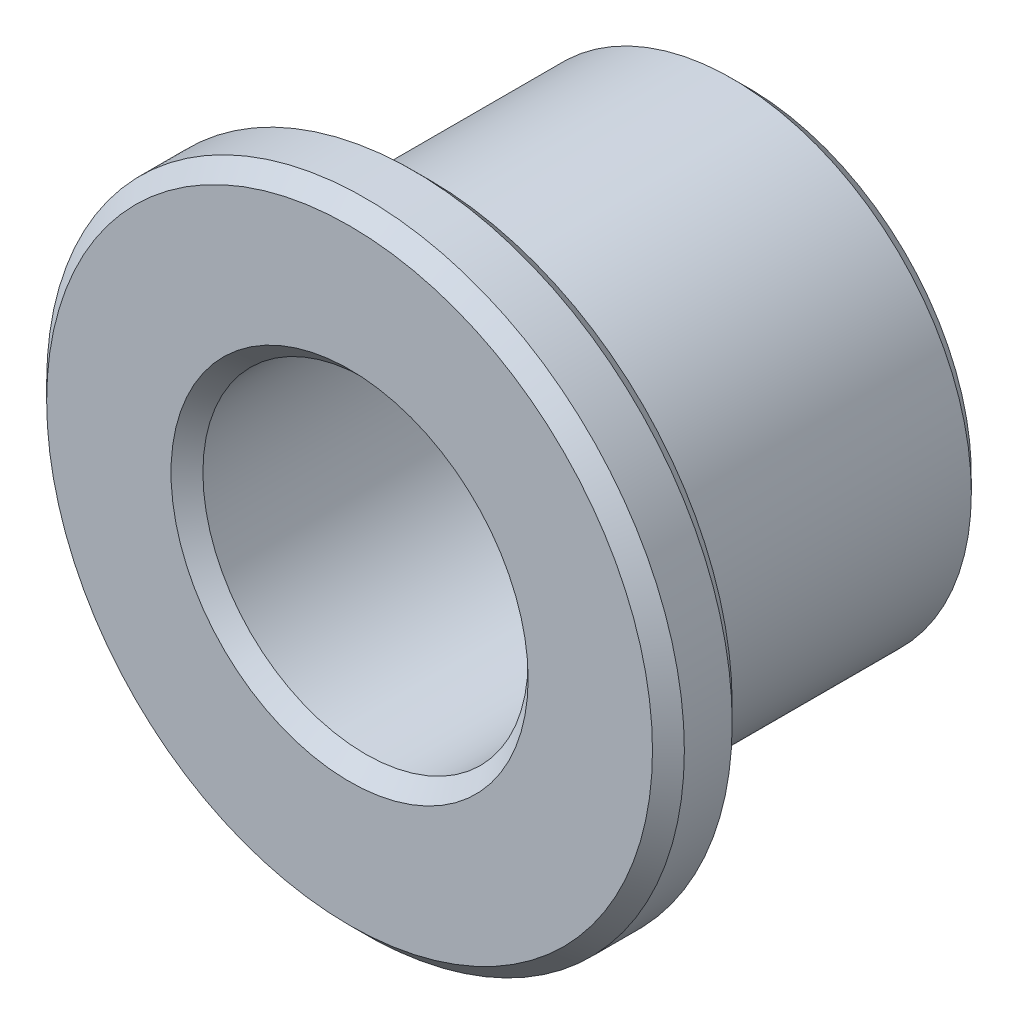
ISO-10303-21;
HEADER;
FILE_DESCRIPTION(('STEP AP214'),'2;1');
FILE_NAME('part.step','',(''),(''),'','','');
FILE_SCHEMA(('AUTOMOTIVE_DESIGN { 1 0 10303 214 1 1 1 1 }'));
ENDSEC;
DATA;
#1=APPLICATION_CONTEXT('core data for automotive mechanical design processes');
#2=APPLICATION_PROTOCOL_DEFINITION('international standard','automotive_design',2000,#1);
#3=PRODUCT_CONTEXT('',#1,'mechanical');
#4=PRODUCT('Part','Part','',(#3));
#5=PRODUCT_RELATED_PRODUCT_CATEGORY('part','',(#4));
#6=PRODUCT_DEFINITION_FORMATION('','',#4);
#7=PRODUCT_DEFINITION_CONTEXT('part definition',#1,'design');
#8=PRODUCT_DEFINITION('design','',#6,#7);
#9=PRODUCT_DEFINITION_SHAPE('','',#8);
#10=(LENGTH_UNIT() NAMED_UNIT(*) SI_UNIT(.MILLI.,.METRE.));
#11=(NAMED_UNIT(*) PLANE_ANGLE_UNIT() SI_UNIT($,.RADIAN.));
#12=(NAMED_UNIT(*) SI_UNIT($,.STERADIAN.) SOLID_ANGLE_UNIT());
#13=UNCERTAINTY_MEASURE_WITH_UNIT(LENGTH_MEASURE(1.E-05),#10,'distance_accuracy_value','');
#14=(GEOMETRIC_REPRESENTATION_CONTEXT(3) GLOBAL_UNCERTAINTY_ASSIGNED_CONTEXT((#13)) GLOBAL_UNIT_ASSIGNED_CONTEXT((#10,
#11,#12)) REPRESENTATION_CONTEXT('',''));
#15=CARTESIAN_POINT('',(0.,0.,0.));
#16=DIRECTION('',(0.,0.,1.));
#17=DIRECTION('',(1.,0.,0.));
#18=AXIS2_PLACEMENT_3D('',#15,#16,#17);
#19=CARTESIAN_POINT('',(0.,0.,0.));
#20=DIRECTION('',(0.,0.,1.));
#21=DIRECTION('',(1.,0.,0.));
#22=AXIS2_PLACEMENT_3D('',#19,#20,#21);
#23=PLANE('',#22);
#24=CARTESIAN_POINT('',(0.,0.,0.));
#25=DIRECTION('',(0.,0.,1.));
#26=DIRECTION('',(1.,0.,0.));
#27=AXIS2_PLACEMENT_3D('',#24,#25,#26);
#28=CIRCLE('',#27,7.11200000000001);
#29=CARTESIAN_POINT('',(7.11200000000001,0.,0.));
#30=VERTEX_POINT('',#29);
#31=EDGE_CURVE('E10',#30,#30,#28,.F.);
#32=ORIENTED_EDGE('',*,*,#31,.T.);
#33=EDGE_LOOP('',(#32));
#34=FACE_BOUND('',#33,.T.);
#35=CARTESIAN_POINT('',(0.,0.,0.));
#36=DIRECTION('',(0.,0.,1.));
#37=DIRECTION('',(1.,0.,0.));
#38=AXIS2_PLACEMENT_3D('',#35,#36,#37);
#39=CIRCLE('',#38,12.065);
#40=CARTESIAN_POINT('',(12.065,0.,0.));
#41=VERTEX_POINT('',#40);
#42=EDGE_CURVE('E52',#41,#41,#39,.T.);
#43=ORIENTED_EDGE('',*,*,#42,.T.);
#44=EDGE_LOOP('',(#43));
#45=FACE_BOUND('',#44,.T.);
#46=ADVANCED_FACE('F43',(#34,#45),#23,.T.);
#47=CARTESIAN_POINT('',(0.,0.,0.));
#48=DIRECTION('',(0.,0.,-1.));
#49=DIRECTION('',(-1.,0.,0.));
#50=AXIS2_PLACEMENT_3D('',#47,#48,#49);
#51=CYLINDRICAL_SURFACE('',#50,12.7);
#52=CARTESIAN_POINT('',(0.,0.,-2.54));
#53=DIRECTION('',(0.,0.,-1.));
#54=DIRECTION('',(-1.,0.,0.));
#55=AXIS2_PLACEMENT_3D('',#52,#53,#54);
#56=CIRCLE('',#55,12.7);
#57=CARTESIAN_POINT('',(-12.7,0.,-2.54));
#58=VERTEX_POINT('',#57);
#59=EDGE_CURVE('E78',#58,#58,#56,.F.);
#60=ORIENTED_EDGE('',*,*,#59,.T.);
#61=EDGE_LOOP('',(#60));
#62=FACE_BOUND('',#61,.T.);
#63=CARTESIAN_POINT('',(0.,0.,-0.635));
#64=DIRECTION('',(0.,0.,1.));
#65=DIRECTION('',(1.,0.,0.));
#66=AXIS2_PLACEMENT_3D('',#63,#64,#65);
#67=CIRCLE('',#66,12.7);
#68=CARTESIAN_POINT('',(12.7,0.,-0.635));
#69=VERTEX_POINT('',#68);
#70=EDGE_CURVE('E82',#69,#69,#67,.F.);
#71=ORIENTED_EDGE('',*,*,#70,.T.);
#72=EDGE_LOOP('',(#71));
#73=FACE_BOUND('',#72,.T.);
#74=ADVANCED_FACE('F128',(#62,#73),#51,.T.);
#75=CARTESIAN_POINT('',(0.,12.7,-3.175));
#76=DIRECTION('',(0.,0.,-1.));
#77=DIRECTION('',(-1.,0.,0.));
#78=AXIS2_PLACEMENT_3D('',#75,#76,#77);
#79=PLANE('',#78);
#80=CARTESIAN_POINT('',(0.,0.,-3.175));
#81=DIRECTION('',(0.,0.,-1.));
#82=DIRECTION('',(-1.,0.,0.));
#83=AXIS2_PLACEMENT_3D('',#80,#81,#82);
#84=CIRCLE('',#83,10.16);
#85=CARTESIAN_POINT('',(-10.16,0.,-3.175));
#86=VERTEX_POINT('',#85);
#87=EDGE_CURVE('E86',#86,#86,#84,.F.);
#88=ORIENTED_EDGE('',*,*,#87,.T.);
#89=EDGE_LOOP('',(#88));
#90=FACE_BOUND('',#89,.T.);
#91=CARTESIAN_POINT('',(0.,0.,-3.175));
#92=DIRECTION('',(0.,0.,-1.));
#93=DIRECTION('',(-1.,0.,0.));
#94=AXIS2_PLACEMENT_3D('',#91,#92,#93);
#95=CIRCLE('',#94,12.065);
#96=CARTESIAN_POINT('',(-12.065,0.,-3.175));
#97=VERTEX_POINT('',#96);
#98=EDGE_CURVE('E90',#97,#97,#95,.T.);
#99=ORIENTED_EDGE('',*,*,#98,.T.);
#100=EDGE_LOOP('',(#99));
#101=FACE_BOUND('',#100,.T.);
#102=ADVANCED_FACE('F124',(#90,#101),#79,.T.);
#103=CARTESIAN_POINT('',(0.,0.,0.));
#104=DIRECTION('',(0.,0.,-1.));
#105=DIRECTION('',(-1.,0.,0.));
#106=AXIS2_PLACEMENT_3D('',#103,#104,#105);
#107=CYLINDRICAL_SURFACE('',#106,9.525);
#108=CARTESIAN_POINT('',(0.,0.,-3.81));
#109=DIRECTION('',(0.,0.,-1.));
#110=DIRECTION('',(-1.,0.,0.));
#111=AXIS2_PLACEMENT_3D('',#108,#109,#110);
#112=CIRCLE('',#111,9.525);
#113=CARTESIAN_POINT('',(-9.525,0.,-3.81));
#114=VERTEX_POINT('',#113);
#115=EDGE_CURVE('E94',#114,#114,#112,.T.);
#116=ORIENTED_EDGE('',*,*,#115,.T.);
#117=EDGE_LOOP('',(#116));
#118=FACE_BOUND('',#117,.T.);
#119=CARTESIAN_POINT('',(0.,0.,-15.24));
#120=DIRECTION('',(0.,0.,-1.));
#121=DIRECTION('',(-1.,0.,0.));
#122=AXIS2_PLACEMENT_3D('',#119,#120,#121);
#123=CIRCLE('',#122,9.525);
#124=CARTESIAN_POINT('',(-9.525,0.,-15.24));
#125=VERTEX_POINT('',#124);
#126=EDGE_CURVE('E98',#125,#125,#123,.F.);
#127=ORIENTED_EDGE('',*,*,#126,.T.);
#128=EDGE_LOOP('',(#127));
#129=FACE_BOUND('',#128,.T.);
#130=ADVANCED_FACE('F104',(#118,#129),#107,.T.);
#131=CARTESIAN_POINT('',(0.,9.525,-15.875));
#132=DIRECTION('',(0.,0.,-1.));
#133=DIRECTION('',(-1.,0.,0.));
#134=AXIS2_PLACEMENT_3D('',#131,#132,#133);
#135=PLANE('',#134);
#136=CARTESIAN_POINT('',(0.,0.,-15.875));
#137=DIRECTION('',(0.,0.,-1.));
#138=DIRECTION('',(-1.,0.,0.));
#139=AXIS2_PLACEMENT_3D('',#136,#137,#138);
#140=CIRCLE('',#139,7.112);
#141=CARTESIAN_POINT('',(-7.112,0.,-15.875));
#142=VERTEX_POINT('',#141);
#143=EDGE_CURVE('E70',#142,#142,#140,.F.);
#144=ORIENTED_EDGE('',*,*,#143,.T.);
#145=EDGE_LOOP('',(#144));
#146=FACE_BOUND('',#145,.T.);
#147=CARTESIAN_POINT('',(0.,0.,-15.875));
#148=DIRECTION('',(0.,0.,-1.));
#149=DIRECTION('',(-1.,0.,0.));
#150=AXIS2_PLACEMENT_3D('',#147,#148,#149);
#151=CIRCLE('',#150,8.89);
#152=CARTESIAN_POINT('',(-8.89,0.,-15.875));
#153=VERTEX_POINT('',#152);
#154=EDGE_CURVE('E74',#153,#153,#151,.T.);
#155=ORIENTED_EDGE('',*,*,#154,.T.);
#156=EDGE_LOOP('',(#155));
#157=FACE_BOUND('',#156,.T.);
#158=ADVANCED_FACE('F112',(#146,#157),#135,.T.);
#159=CARTESIAN_POINT('',(0.,0.,-15.876));
#160=DIRECTION('',(0.,0.,1.));
#161=DIRECTION('',(1.,0.,0.));
#162=AXIS2_PLACEMENT_3D('',#159,#160,#161);
#163=CYLINDRICAL_SURFACE('',#162,6.477);
#164=CARTESIAN_POINT('',(0.,0.,-15.24));
#165=DIRECTION('',(0.,0.,-1.));
#166=DIRECTION('',(-1.,0.,0.));
#167=AXIS2_PLACEMENT_3D('',#164,#165,#166);
#168=CIRCLE('',#167,6.477);
#169=CARTESIAN_POINT('',(-6.477,0.,-15.24));
#170=VERTEX_POINT('',#169);
#171=EDGE_CURVE('E58',#170,#170,#168,.T.);
#172=ORIENTED_EDGE('',*,*,#171,.T.);
#173=EDGE_LOOP('',(#172));
#174=FACE_BOUND('',#173,.T.);
#175=CARTESIAN_POINT('',(0.,0.,-0.635000000000011));
#176=DIRECTION('',(0.,0.,1.));
#177=DIRECTION('',(1.,0.,0.));
#178=AXIS2_PLACEMENT_3D('',#175,#176,#177);
#179=CIRCLE('',#178,6.477);
#180=CARTESIAN_POINT('',(6.477,0.,-0.635000000000011));
#181=VERTEX_POINT('',#180);
#182=EDGE_CURVE('E64',#181,#181,#179,.T.);
#183=ORIENTED_EDGE('',*,*,#182,.T.);
#184=EDGE_LOOP('',(#183));
#185=FACE_BOUND('',#184,.T.);
#186=ADVANCED_FACE('F114',(#174,#185),#163,.F.);
#187=CARTESIAN_POINT('',(0.,0.,-3.81));
#188=DIRECTION('',(0.,0.,1.));
#189=DIRECTION('',(1.,0.,0.));
#190=AXIS2_PLACEMENT_3D('',#187,#188,#189);
#191=CONICAL_SURFACE('',#190,9.525,0.785398163397447);
#192=ORIENTED_EDGE('',*,*,#87,.F.);
#193=EDGE_LOOP('',(#192));
#194=FACE_BOUND('',#193,.T.);
#195=ORIENTED_EDGE('',*,*,#115,.F.);
#196=EDGE_LOOP('',(#195));
#197=FACE_BOUND('',#196,.T.);
#198=ADVANCED_FACE('F121',(#194,#197),#191,.T.);
#199=CARTESIAN_POINT('',(0.,0.,-3.175));
#200=DIRECTION('',(0.,0.,1.));
#201=DIRECTION('',(1.,0.,0.));
#202=AXIS2_PLACEMENT_3D('',#199,#200,#201);
#203=CONICAL_SURFACE('',#202,12.065,0.785398163397446);
#204=ORIENTED_EDGE('',*,*,#59,.F.);
#205=EDGE_LOOP('',(#204));
#206=FACE_BOUND('',#205,.T.);
#207=ORIENTED_EDGE('',*,*,#98,.F.);
#208=EDGE_LOOP('',(#207));
#209=FACE_BOUND('',#208,.T.);
#210=ADVANCED_FACE('F143',(#206,#209),#203,.T.);
#211=CARTESIAN_POINT('',(0.,0.,-15.875));
#212=DIRECTION('',(0.,0.,-1.));
#213=DIRECTION('',(-1.,0.,0.));
#214=AXIS2_PLACEMENT_3D('',#211,#212,#213);
#215=CONICAL_SURFACE('',#214,7.112,0.785398163397446);
#216=ORIENTED_EDGE('',*,*,#171,.F.);
#217=EDGE_LOOP('',(#216));
#218=FACE_BOUND('',#217,.T.);
#219=ORIENTED_EDGE('',*,*,#143,.F.);
#220=EDGE_LOOP('',(#219));
#221=FACE_BOUND('',#220,.T.);
#222=ADVANCED_FACE('F150',(#218,#221),#215,.F.);
#223=CARTESIAN_POINT('',(0.,0.,-0.635000000000011));
#224=DIRECTION('',(0.,0.,1.));
#225=DIRECTION('',(1.,0.,0.));
#226=AXIS2_PLACEMENT_3D('',#223,#224,#225);
#227=CONICAL_SURFACE('',#226,6.477,0.78539816339745);
#228=ORIENTED_EDGE('',*,*,#31,.F.);
#229=EDGE_LOOP('',(#228));
#230=FACE_BOUND('',#229,.T.);
#231=ORIENTED_EDGE('',*,*,#182,.F.);
#232=EDGE_LOOP('',(#231));
#233=FACE_BOUND('',#232,.T.);
#234=ADVANCED_FACE('F109',(#230,#233),#227,.F.);
#235=CARTESIAN_POINT('',(0.,0.,-15.875));
#236=DIRECTION('',(0.,0.,1.));
#237=DIRECTION('',(1.,0.,0.));
#238=AXIS2_PLACEMENT_3D('',#235,#236,#237);
#239=CONICAL_SURFACE('',#238,8.89,0.785398163397447);
#240=ORIENTED_EDGE('',*,*,#126,.F.);
#241=EDGE_LOOP('',(#240));
#242=FACE_BOUND('',#241,.T.);
#243=ORIENTED_EDGE('',*,*,#154,.F.);
#244=EDGE_LOOP('',(#243));
#245=FACE_BOUND('',#244,.T.);
#246=ADVANCED_FACE('F106',(#242,#245),#239,.T.);
#247=CARTESIAN_POINT('',(0.,0.,-0.635));
#248=DIRECTION('',(0.,0.,-1.));
#249=DIRECTION('',(-1.,0.,0.));
#250=AXIS2_PLACEMENT_3D('',#247,#248,#249);
#251=CONICAL_SURFACE('',#250,12.7,0.785398163397452);
#252=ORIENTED_EDGE('',*,*,#42,.F.);
#253=EDGE_LOOP('',(#252));
#254=FACE_BOUND('',#253,.T.);
#255=ORIENTED_EDGE('',*,*,#70,.F.);
#256=EDGE_LOOP('',(#255));
#257=FACE_BOUND('',#256,.T.);
#258=ADVANCED_FACE('F46',(#254,#257),#251,.T.);
#259=CLOSED_SHELL('',(#46,#74,#102,#130,#158,#186,#198,#210,#222,#234,#246,#258));
#260=MANIFOLD_SOLID_BREP('B2',#259);
#261=ADVANCED_BREP_SHAPE_REPRESENTATION('',(#18,#260),#14);
#262=SHAPE_DEFINITION_REPRESENTATION(#9,#261);
ENDSEC;
END-ISO-10303-21;
